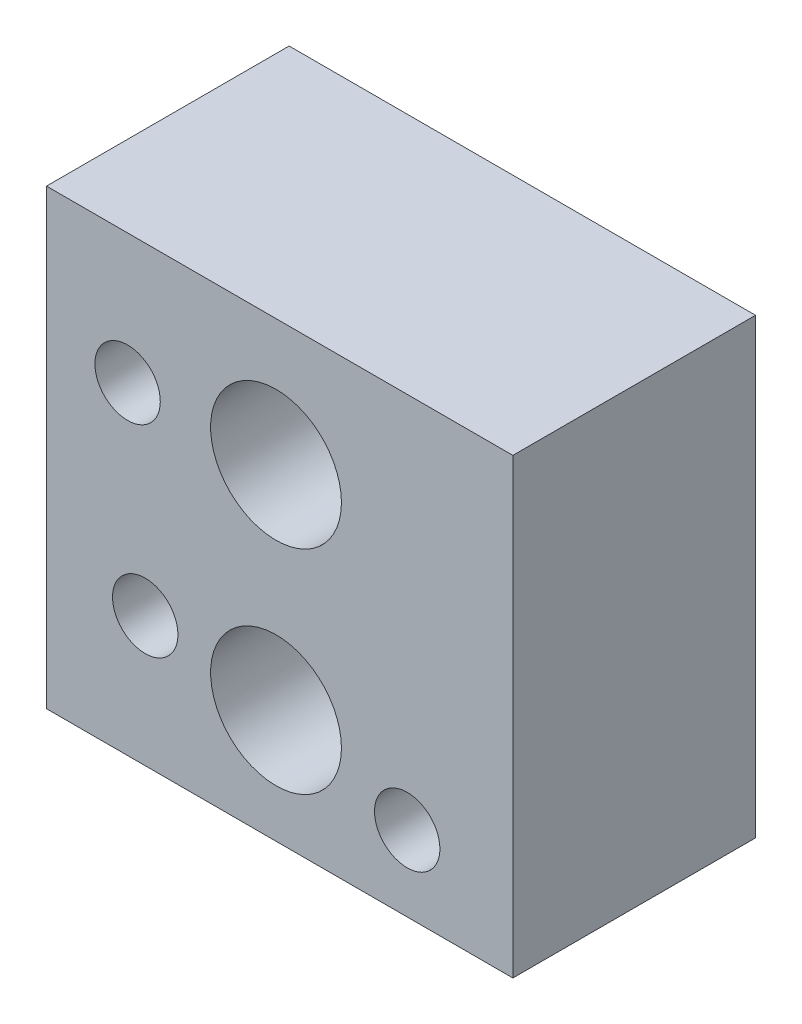
ISO-10303-21;
HEADER;
FILE_DESCRIPTION(('STEP AP214'),'2;1');
FILE_NAME('part.step','',(''),(''),'','','');
FILE_SCHEMA(('AUTOMOTIVE_DESIGN { 1 0 10303 214 1 1 1 1 }'));
ENDSEC;
DATA;
#1=APPLICATION_CONTEXT('core data for automotive mechanical design processes');
#2=APPLICATION_PROTOCOL_DEFINITION('international standard','automotive_design',2000,#1);
#3=PRODUCT_CONTEXT('',#1,'mechanical');
#4=PRODUCT('Part','Part','',(#3));
#5=PRODUCT_RELATED_PRODUCT_CATEGORY('part','',(#4));
#6=PRODUCT_DEFINITION_FORMATION('','',#4);
#7=PRODUCT_DEFINITION_CONTEXT('part definition',#1,'design');
#8=PRODUCT_DEFINITION('design','',#6,#7);
#9=PRODUCT_DEFINITION_SHAPE('','',#8);
#10=(LENGTH_UNIT() NAMED_UNIT(*) SI_UNIT(.MILLI.,.METRE.));
#11=(NAMED_UNIT(*) PLANE_ANGLE_UNIT() SI_UNIT($,.RADIAN.));
#12=(NAMED_UNIT(*) SI_UNIT($,.STERADIAN.) SOLID_ANGLE_UNIT());
#13=UNCERTAINTY_MEASURE_WITH_UNIT(LENGTH_MEASURE(1.E-05),#10,'distance_accuracy_value','');
#14=(GEOMETRIC_REPRESENTATION_CONTEXT(3) GLOBAL_UNCERTAINTY_ASSIGNED_CONTEXT((#13)) GLOBAL_UNIT_ASSIGNED_CONTEXT((#10,
#11,#12)) REPRESENTATION_CONTEXT('',''));
#15=CARTESIAN_POINT('',(0.,0.,0.));
#16=DIRECTION('',(0.,0.,1.));
#17=DIRECTION('',(1.,0.,0.));
#18=AXIS2_PLACEMENT_3D('',#15,#16,#17);
#19=CARTESIAN_POINT('',(-101.842933049947,80.9102019128587,94.234));
#20=DIRECTION('',(1.,0.,0.));
#21=DIRECTION('',(0.,0.,-1.));
#22=AXIS2_PLACEMENT_3D('',#19,#20,#21);
#23=PLANE('',#22);
#24=DIRECTION('',(0.,-1.,0.));
#25=VECTOR('',#24,1.);
#26=CARTESIAN_POINT('',(-101.842933049947,80.9102019128587,0.));
#27=LINE('',#26,#25);
#28=CARTESIAN_POINT('',(-101.842933049947,80.9102019128587,0.));
#29=VERTEX_POINT('',#28);
#30=CARTESIAN_POINT('',(-101.842933049947,-94.8653560042508,0.));
#31=VERTEX_POINT('',#30);
#32=EDGE_CURVE('E101',#29,#31,#27,.T.);
#33=ORIENTED_EDGE('',*,*,#32,.T.);
#34=DIRECTION('',(0.,0.,-1.));
#35=VECTOR('',#34,1.);
#36=CARTESIAN_POINT('',(-101.842933049947,-94.8653560042508,94.234));
#37=LINE('',#36,#35);
#38=CARTESIAN_POINT('',(-101.842933049947,-94.8653560042508,94.234));
#39=VERTEX_POINT('',#38);
#40=EDGE_CURVE('E11',#39,#31,#37,.T.);
#41=ORIENTED_EDGE('',*,*,#40,.F.);
#42=DIRECTION('',(0.,-1.,0.));
#43=VECTOR('',#42,1.);
#44=CARTESIAN_POINT('',(-101.842933049947,80.9102019128587,94.234));
#45=LINE('',#44,#43);
#46=CARTESIAN_POINT('',(-101.842933049947,80.9102019128587,94.234));
#47=VERTEX_POINT('',#46);
#48=EDGE_CURVE('E89',#47,#39,#45,.T.);
#49=ORIENTED_EDGE('',*,*,#48,.F.);
#50=DIRECTION('',(0.,0.,-1.));
#51=VECTOR('',#50,1.);
#52=CARTESIAN_POINT('',(-101.842933049947,80.9102019128587,94.234));
#53=LINE('',#52,#51);
#54=EDGE_CURVE('E97',#47,#29,#53,.T.);
#55=ORIENTED_EDGE('',*,*,#54,.T.);
#56=EDGE_LOOP('',(#33,#41,#49,#55));
#57=FACE_BOUND('',#56,.T.);
#58=ADVANCED_FACE('F38',(#57),#23,.F.);
#59=CARTESIAN_POINT('',(-101.842933049947,-94.8653560042508,94.234));
#60=DIRECTION('',(0.,1.,0.));
#61=DIRECTION('',(0.,0.,1.));
#62=AXIS2_PLACEMENT_3D('',#59,#60,#61);
#63=PLANE('',#62);
#64=DIRECTION('',(1.,0.,0.));
#65=VECTOR('',#64,1.);
#66=CARTESIAN_POINT('',(-101.842933049947,-94.8653560042508,0.));
#67=LINE('',#66,#65);
#68=CARTESIAN_POINT('',(79.2771519659936,-94.8653560042508,0.));
#69=VERTEX_POINT('',#68);
#70=EDGE_CURVE('E93',#31,#69,#67,.T.);
#71=ORIENTED_EDGE('',*,*,#70,.T.);
#72=DIRECTION('',(0.,0.,-1.));
#73=VECTOR('',#72,1.);
#74=CARTESIAN_POINT('',(79.2771519659936,-94.8653560042508,94.234));
#75=LINE('',#74,#73);
#76=CARTESIAN_POINT('',(79.2771519659936,-94.8653560042508,94.234));
#77=VERTEX_POINT('',#76);
#78=EDGE_CURVE('E46',#77,#69,#75,.T.);
#79=ORIENTED_EDGE('',*,*,#78,.F.);
#80=DIRECTION('',(1.,0.,0.));
#81=VECTOR('',#80,1.);
#82=CARTESIAN_POINT('',(-101.842933049947,-94.8653560042508,94.234));
#83=LINE('',#82,#81);
#84=EDGE_CURVE('E84',#39,#77,#83,.T.);
#85=ORIENTED_EDGE('',*,*,#84,.F.);
#86=ORIENTED_EDGE('',*,*,#40,.T.);
#87=EDGE_LOOP('',(#71,#79,#85,#86));
#88=FACE_BOUND('',#87,.T.);
#89=ADVANCED_FACE('F92',(#88),#63,.F.);
#90=CARTESIAN_POINT('',(79.2771519659936,80.9102019128587,94.234));
#91=DIRECTION('',(-1.,0.,0.));
#92=DIRECTION('',(0.,0.,1.));
#93=AXIS2_PLACEMENT_3D('',#90,#91,#92);
#94=PLANE('',#93);
#95=DIRECTION('',(0.,1.,0.));
#96=VECTOR('',#95,1.);
#97=CARTESIAN_POINT('',(79.2771519659936,80.9102019128587,0.));
#98=LINE('',#97,#96);
#99=CARTESIAN_POINT('',(79.2771519659936,80.9102019128587,0.));
#100=VERTEX_POINT('',#99);
#101=EDGE_CURVE('E71',#69,#100,#98,.T.);
#102=ORIENTED_EDGE('',*,*,#101,.T.);
#103=DIRECTION('',(0.,0.,-1.));
#104=VECTOR('',#103,1.);
#105=CARTESIAN_POINT('',(79.2771519659936,80.9102019128587,94.234));
#106=LINE('',#105,#104);
#107=CARTESIAN_POINT('',(79.2771519659936,80.9102019128587,94.234));
#108=VERTEX_POINT('',#107);
#109=EDGE_CURVE('E94',#108,#100,#106,.T.);
#110=ORIENTED_EDGE('',*,*,#109,.F.);
#111=DIRECTION('',(0.,1.,0.));
#112=VECTOR('',#111,1.);
#113=CARTESIAN_POINT('',(79.2771519659936,80.9102019128587,94.234));
#114=LINE('',#113,#112);
#115=EDGE_CURVE('E87',#77,#108,#114,.T.);
#116=ORIENTED_EDGE('',*,*,#115,.F.);
#117=ORIENTED_EDGE('',*,*,#78,.T.);
#118=EDGE_LOOP('',(#102,#110,#116,#117));
#119=FACE_BOUND('',#118,.T.);
#120=ADVANCED_FACE('F95',(#119),#94,.F.);
#121=CARTESIAN_POINT('',(-101.842933049947,80.9102019128587,94.234));
#122=DIRECTION('',(0.,-1.,0.));
#123=DIRECTION('',(0.,0.,-1.));
#124=AXIS2_PLACEMENT_3D('',#121,#122,#123);
#125=PLANE('',#124);
#126=DIRECTION('',(-1.,0.,0.));
#127=VECTOR('',#126,1.);
#128=CARTESIAN_POINT('',(-101.842933049947,80.9102019128587,0.));
#129=LINE('',#128,#127);
#130=EDGE_CURVE('E77',#100,#29,#129,.T.);
#131=ORIENTED_EDGE('',*,*,#130,.T.);
#132=ORIENTED_EDGE('',*,*,#54,.F.);
#133=DIRECTION('',(-1.,0.,0.));
#134=VECTOR('',#133,1.);
#135=CARTESIAN_POINT('',(-101.842933049947,80.9102019128587,94.234));
#136=LINE('',#135,#134);
#137=EDGE_CURVE('E54',#108,#47,#136,.T.);
#138=ORIENTED_EDGE('',*,*,#137,.F.);
#139=ORIENTED_EDGE('',*,*,#109,.T.);
#140=EDGE_LOOP('',(#131,#132,#138,#139));
#141=FACE_BOUND('',#140,.T.);
#142=ADVANCED_FACE('F109',(#141),#125,.F.);
#143=CARTESIAN_POINT('',(-101.842933049947,-94.8653560042508,94.234));
#144=DIRECTION('',(0.,0.,1.));
#145=DIRECTION('',(1.,0.,0.));
#146=AXIS2_PLACEMENT_3D('',#143,#144,#145);
#147=PLANE('',#146);
#148=CARTESIAN_POINT('',(-12.7,-50.8,94.234));
#149=DIRECTION('',(0.,0.,1.));
#150=DIRECTION('',(1.,0.,0.));
#151=AXIS2_PLACEMENT_3D('',#148,#149,#150);
#152=CIRCLE('',#151,25.4);
#153=CARTESIAN_POINT('',(12.7,-50.8,94.234));
#154=VERTEX_POINT('',#153);
#155=EDGE_CURVE('E139',#154,#154,#152,.T.);
#156=ORIENTED_EDGE('',*,*,#155,.F.);
#157=EDGE_LOOP('',(#156));
#158=FACE_BOUND('',#157,.T.);
#159=CARTESIAN_POINT('',(-12.7,31.75,94.234));
#160=DIRECTION('',(0.,0.,1.));
#161=DIRECTION('',(1.,0.,0.));
#162=AXIS2_PLACEMENT_3D('',#159,#160,#161);
#163=CIRCLE('',#162,25.4);
#164=CARTESIAN_POINT('',(12.7,31.75,94.234));
#165=VERTEX_POINT('',#164);
#166=EDGE_CURVE('E133',#165,#165,#163,.T.);
#167=ORIENTED_EDGE('',*,*,#166,.F.);
#168=EDGE_LOOP('',(#167));
#169=FACE_BOUND('',#168,.T.);
#170=CARTESIAN_POINT('',(-63.5,-44.45,94.234));
#171=DIRECTION('',(0.,0.,1.));
#172=DIRECTION('',(1.,0.,0.));
#173=AXIS2_PLACEMENT_3D('',#170,#171,#172);
#174=CIRCLE('',#173,12.7);
#175=CARTESIAN_POINT('',(-50.8,-44.45,94.234));
#176=VERTEX_POINT('',#175);
#177=EDGE_CURVE('E127',#176,#176,#174,.T.);
#178=ORIENTED_EDGE('',*,*,#177,.F.);
#179=EDGE_LOOP('',(#178));
#180=FACE_BOUND('',#179,.T.);
#181=CARTESIAN_POINT('',(38.2469402460401,-65.6337677663714,94.234));
#182=DIRECTION('',(0.,0.,1.));
#183=DIRECTION('',(1.,0.,0.));
#184=AXIS2_PLACEMENT_3D('',#181,#182,#183);
#185=CIRCLE('',#184,12.7);
#186=CARTESIAN_POINT('',(50.9469402460401,-65.6337677663714,94.234));
#187=VERTEX_POINT('',#186);
#188=EDGE_CURVE('E121',#187,#187,#185,.T.);
#189=ORIENTED_EDGE('',*,*,#188,.F.);
#190=EDGE_LOOP('',(#189));
#191=FACE_BOUND('',#190,.T.);
#192=CARTESIAN_POINT('',(-70.3466874757623,30.5418639441655,94.234));
#193=DIRECTION('',(0.,0.,1.));
#194=DIRECTION('',(1.,0.,0.));
#195=AXIS2_PLACEMENT_3D('',#192,#193,#194);
#196=CIRCLE('',#195,12.7);
#197=CARTESIAN_POINT('',(-57.6466874757623,30.5418639441655,94.234));
#198=VERTEX_POINT('',#197);
#199=EDGE_CURVE('E115',#198,#198,#196,.T.);
#200=ORIENTED_EDGE('',*,*,#199,.F.);
#201=EDGE_LOOP('',(#200));
#202=FACE_BOUND('',#201,.T.);
#203=ORIENTED_EDGE('',*,*,#48,.T.);
#204=ORIENTED_EDGE('',*,*,#84,.T.);
#205=ORIENTED_EDGE('',*,*,#115,.T.);
#206=ORIENTED_EDGE('',*,*,#137,.T.);
#207=EDGE_LOOP('',(#203,#204,#205,#206));
#208=FACE_BOUND('',#207,.T.);
#209=ADVANCED_FACE('F85',(#158,#169,#180,#191,#202,#208),#147,.T.);
#210=CARTESIAN_POINT('',(-101.842933049947,-94.8653560042508,0.));
#211=DIRECTION('',(0.,0.,1.));
#212=DIRECTION('',(1.,0.,0.));
#213=AXIS2_PLACEMENT_3D('',#210,#211,#212);
#214=PLANE('',#213);
#215=CARTESIAN_POINT('',(-12.7,-50.8,0.));
#216=DIRECTION('',(0.,0.,1.));
#217=DIRECTION('',(1.,0.,0.));
#218=AXIS2_PLACEMENT_3D('',#215,#216,#217);
#219=CIRCLE('',#218,25.4);
#220=CARTESIAN_POINT('',(12.7,-50.8,0.));
#221=VERTEX_POINT('',#220);
#222=EDGE_CURVE('E136',#221,#221,#219,.T.);
#223=ORIENTED_EDGE('',*,*,#222,.T.);
#224=EDGE_LOOP('',(#223));
#225=FACE_BOUND('',#224,.T.);
#226=CARTESIAN_POINT('',(-12.7,31.75,0.));
#227=DIRECTION('',(0.,0.,1.));
#228=DIRECTION('',(1.,0.,0.));
#229=AXIS2_PLACEMENT_3D('',#226,#227,#228);
#230=CIRCLE('',#229,25.4);
#231=CARTESIAN_POINT('',(12.7,31.75,0.));
#232=VERTEX_POINT('',#231);
#233=EDGE_CURVE('E130',#232,#232,#230,.T.);
#234=ORIENTED_EDGE('',*,*,#233,.T.);
#235=EDGE_LOOP('',(#234));
#236=FACE_BOUND('',#235,.T.);
#237=CARTESIAN_POINT('',(-63.5,-44.45,0.));
#238=DIRECTION('',(0.,0.,1.));
#239=DIRECTION('',(1.,0.,0.));
#240=AXIS2_PLACEMENT_3D('',#237,#238,#239);
#241=CIRCLE('',#240,12.7);
#242=CARTESIAN_POINT('',(-50.8,-44.45,0.));
#243=VERTEX_POINT('',#242);
#244=EDGE_CURVE('E124',#243,#243,#241,.T.);
#245=ORIENTED_EDGE('',*,*,#244,.T.);
#246=EDGE_LOOP('',(#245));
#247=FACE_BOUND('',#246,.T.);
#248=CARTESIAN_POINT('',(38.2469402460401,-65.6337677663714,0.));
#249=DIRECTION('',(0.,0.,1.));
#250=DIRECTION('',(1.,0.,0.));
#251=AXIS2_PLACEMENT_3D('',#248,#249,#250);
#252=CIRCLE('',#251,12.7);
#253=CARTESIAN_POINT('',(50.9469402460401,-65.6337677663714,0.));
#254=VERTEX_POINT('',#253);
#255=EDGE_CURVE('E118',#254,#254,#252,.T.);
#256=ORIENTED_EDGE('',*,*,#255,.T.);
#257=EDGE_LOOP('',(#256));
#258=FACE_BOUND('',#257,.T.);
#259=CARTESIAN_POINT('',(-70.3466874757623,30.5418639441655,0.));
#260=DIRECTION('',(0.,0.,1.));
#261=DIRECTION('',(1.,0.,0.));
#262=AXIS2_PLACEMENT_3D('',#259,#260,#261);
#263=CIRCLE('',#262,12.7);
#264=CARTESIAN_POINT('',(-57.6466874757623,30.5418639441655,0.));
#265=VERTEX_POINT('',#264);
#266=EDGE_CURVE('E104',#265,#265,#263,.T.);
#267=ORIENTED_EDGE('',*,*,#266,.T.);
#268=EDGE_LOOP('',(#267));
#269=FACE_BOUND('',#268,.T.);
#270=ORIENTED_EDGE('',*,*,#32,.F.);
#271=ORIENTED_EDGE('',*,*,#130,.F.);
#272=ORIENTED_EDGE('',*,*,#101,.F.);
#273=ORIENTED_EDGE('',*,*,#70,.F.);
#274=EDGE_LOOP('',(#270,#271,#272,#273));
#275=FACE_BOUND('',#274,.T.);
#276=ADVANCED_FACE('F112',(#225,#236,#247,#258,#269,#275),#214,.F.);
#277=CARTESIAN_POINT('',(-70.3466874757623,30.5418639441655,0.));
#278=DIRECTION('',(0.,0.,1.));
#279=DIRECTION('',(1.,0.,0.));
#280=AXIS2_PLACEMENT_3D('',#277,#278,#279);
#281=CYLINDRICAL_SURFACE('',#280,12.7);
#282=ORIENTED_EDGE('',*,*,#266,.F.);
#283=EDGE_LOOP('',(#282));
#284=FACE_BOUND('',#283,.T.);
#285=ORIENTED_EDGE('',*,*,#199,.T.);
#286=EDGE_LOOP('',(#285));
#287=FACE_BOUND('',#286,.T.);
#288=ADVANCED_FACE('F165',(#284,#287),#281,.F.);
#289=CARTESIAN_POINT('',(38.2469402460401,-65.6337677663714,0.));
#290=DIRECTION('',(0.,0.,1.));
#291=DIRECTION('',(1.,0.,0.));
#292=AXIS2_PLACEMENT_3D('',#289,#290,#291);
#293=CYLINDRICAL_SURFACE('',#292,12.7);
#294=ORIENTED_EDGE('',*,*,#255,.F.);
#295=EDGE_LOOP('',(#294));
#296=FACE_BOUND('',#295,.T.);
#297=ORIENTED_EDGE('',*,*,#188,.T.);
#298=EDGE_LOOP('',(#297));
#299=FACE_BOUND('',#298,.T.);
#300=ADVANCED_FACE('F167',(#296,#299),#293,.F.);
#301=CARTESIAN_POINT('',(-63.5,-44.45,0.));
#302=DIRECTION('',(0.,0.,1.));
#303=DIRECTION('',(1.,0.,0.));
#304=AXIS2_PLACEMENT_3D('',#301,#302,#303);
#305=CYLINDRICAL_SURFACE('',#304,12.7);
#306=ORIENTED_EDGE('',*,*,#244,.F.);
#307=EDGE_LOOP('',(#306));
#308=FACE_BOUND('',#307,.T.);
#309=ORIENTED_EDGE('',*,*,#177,.T.);
#310=EDGE_LOOP('',(#309));
#311=FACE_BOUND('',#310,.T.);
#312=ADVANCED_FACE('F174',(#308,#311),#305,.F.);
#313=CARTESIAN_POINT('',(-12.7,31.75,0.));
#314=DIRECTION('',(0.,0.,1.));
#315=DIRECTION('',(1.,0.,0.));
#316=AXIS2_PLACEMENT_3D('',#313,#314,#315);
#317=CYLINDRICAL_SURFACE('',#316,25.4);
#318=ORIENTED_EDGE('',*,*,#233,.F.);
#319=EDGE_LOOP('',(#318));
#320=FACE_BOUND('',#319,.T.);
#321=ORIENTED_EDGE('',*,*,#166,.T.);
#322=EDGE_LOOP('',(#321));
#323=FACE_BOUND('',#322,.T.);
#324=ADVANCED_FACE('F150',(#320,#323),#317,.F.);
#325=CARTESIAN_POINT('',(-12.7,-50.8,0.));
#326=DIRECTION('',(0.,0.,1.));
#327=DIRECTION('',(1.,0.,0.));
#328=AXIS2_PLACEMENT_3D('',#325,#326,#327);
#329=CYLINDRICAL_SURFACE('',#328,25.4);
#330=ORIENTED_EDGE('',*,*,#222,.F.);
#331=EDGE_LOOP('',(#330));
#332=FACE_BOUND('',#331,.T.);
#333=ORIENTED_EDGE('',*,*,#155,.T.);
#334=EDGE_LOOP('',(#333));
#335=FACE_BOUND('',#334,.T.);
#336=ADVANCED_FACE('F147',(#332,#335),#329,.F.);
#337=CLOSED_SHELL('',(#58,#89,#120,#142,#209,#276,#288,#300,#312,#324,#336));
#338=MANIFOLD_SOLID_BREP('B2',#337);
#339=ADVANCED_BREP_SHAPE_REPRESENTATION('',(#18,#338),#14);
#340=SHAPE_DEFINITION_REPRESENTATION(#9,#339);
ENDSEC;
END-ISO-10303-21;
